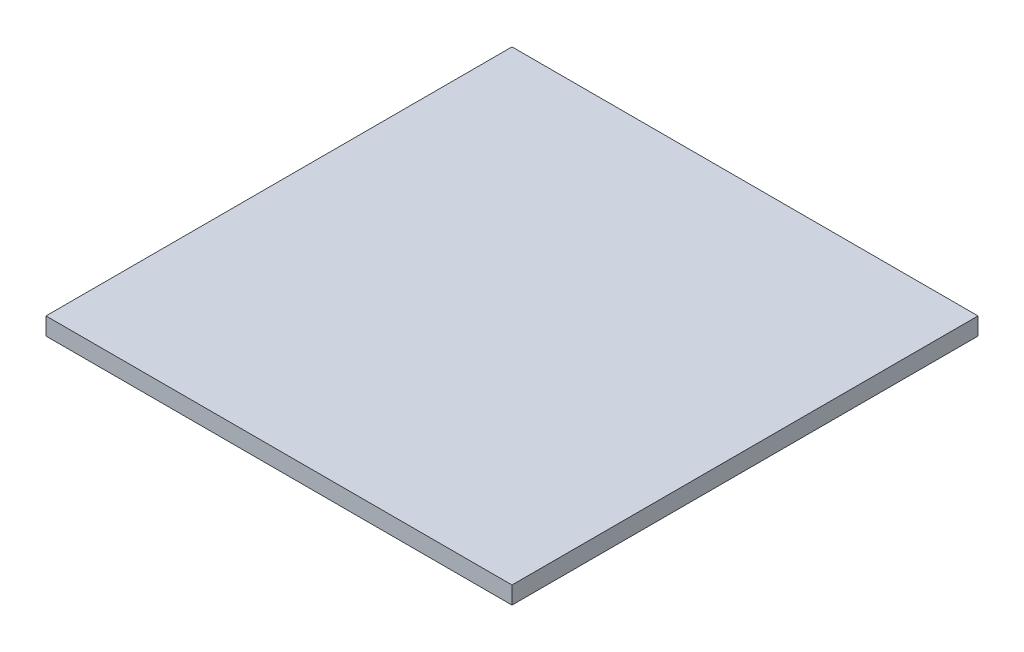
ISO-10303-21;
HEADER;
FILE_DESCRIPTION(('STEP AP214'),'2;1');
FILE_NAME('part.step','',(''),(''),'','','');
FILE_SCHEMA(('AUTOMOTIVE_DESIGN { 1 0 10303 214 1 1 1 1 }'));
ENDSEC;
DATA;
#1=APPLICATION_CONTEXT('core data for automotive mechanical design processes');
#2=APPLICATION_PROTOCOL_DEFINITION('international standard','automotive_design',2000,#1);
#3=PRODUCT_CONTEXT('',#1,'mechanical');
#4=PRODUCT('Part','Part','',(#3));
#5=PRODUCT_RELATED_PRODUCT_CATEGORY('part','',(#4));
#6=PRODUCT_DEFINITION_FORMATION('','',#4);
#7=PRODUCT_DEFINITION_CONTEXT('part definition',#1,'design');
#8=PRODUCT_DEFINITION('design','',#6,#7);
#9=PRODUCT_DEFINITION_SHAPE('','',#8);
#10=(LENGTH_UNIT() NAMED_UNIT(*) SI_UNIT(.MILLI.,.METRE.));
#11=(NAMED_UNIT(*) PLANE_ANGLE_UNIT() SI_UNIT($,.RADIAN.));
#12=(NAMED_UNIT(*) SI_UNIT($,.STERADIAN.) SOLID_ANGLE_UNIT());
#13=UNCERTAINTY_MEASURE_WITH_UNIT(LENGTH_MEASURE(1.E-05),#10,'distance_accuracy_value','');
#14=(GEOMETRIC_REPRESENTATION_CONTEXT(3) GLOBAL_UNCERTAINTY_ASSIGNED_CONTEXT((#13)) GLOBAL_UNIT_ASSIGNED_CONTEXT((#10,
#11,#12)) REPRESENTATION_CONTEXT('',''));
#15=CARTESIAN_POINT('',(0.,0.,0.));
#16=DIRECTION('',(0.,0.,1.));
#17=DIRECTION('',(1.,0.,0.));
#18=AXIS2_PLACEMENT_3D('',#15,#16,#17);
#19=CARTESIAN_POINT('',(20.,1.5,-20.));
#20=DIRECTION('',(-1.,0.,0.));
#21=DIRECTION('',(0.,0.,1.));
#22=AXIS2_PLACEMENT_3D('',#19,#20,#21);
#23=PLANE('',#22);
#24=DIRECTION('',(0.,0.,-1.));
#25=VECTOR('',#24,1.);
#26=CARTESIAN_POINT('',(20.,0.,-20.));
#27=LINE('',#26,#25);
#28=CARTESIAN_POINT('',(20.,0.,20.));
#29=VERTEX_POINT('',#28);
#30=CARTESIAN_POINT('',(20.,0.,-20.));
#31=VERTEX_POINT('',#30);
#32=EDGE_CURVE('E102',#29,#31,#27,.T.);
#33=ORIENTED_EDGE('',*,*,#32,.T.);
#34=DIRECTION('',(0.,-1.,0.));
#35=VECTOR('',#34,1.);
#36=CARTESIAN_POINT('',(20.,1.5,-20.));
#37=LINE('',#36,#35);
#38=CARTESIAN_POINT('',(20.,1.5,-20.));
#39=VERTEX_POINT('',#38);
#40=EDGE_CURVE('E11',#39,#31,#37,.T.);
#41=ORIENTED_EDGE('',*,*,#40,.F.);
#42=DIRECTION('',(0.,0.,-1.));
#43=VECTOR('',#42,1.);
#44=CARTESIAN_POINT('',(20.,1.5,-20.));
#45=LINE('',#44,#43);
#46=CARTESIAN_POINT('',(20.,1.5,20.));
#47=VERTEX_POINT('',#46);
#48=EDGE_CURVE('E90',#47,#39,#45,.T.);
#49=ORIENTED_EDGE('',*,*,#48,.F.);
#50=DIRECTION('',(0.,-1.,0.));
#51=VECTOR('',#50,1.);
#52=CARTESIAN_POINT('',(20.,1.5,20.));
#53=LINE('',#52,#51);
#54=EDGE_CURVE('E98',#47,#29,#53,.T.);
#55=ORIENTED_EDGE('',*,*,#54,.T.);
#56=EDGE_LOOP('',(#33,#41,#49,#55));
#57=FACE_BOUND('',#56,.T.);
#58=ADVANCED_FACE('F39',(#57),#23,.F.);
#59=CARTESIAN_POINT('',(-20.,1.5,-20.));
#60=DIRECTION('',(0.,0.,1.));
#61=DIRECTION('',(1.,0.,0.));
#62=AXIS2_PLACEMENT_3D('',#59,#60,#61);
#63=PLANE('',#62);
#64=DIRECTION('',(-1.,0.,0.));
#65=VECTOR('',#64,1.);
#66=CARTESIAN_POINT('',(-20.,0.,-20.));
#67=LINE('',#66,#65);
#68=CARTESIAN_POINT('',(-20.,0.,-20.));
#69=VERTEX_POINT('',#68);
#70=EDGE_CURVE('E94',#31,#69,#67,.T.);
#71=ORIENTED_EDGE('',*,*,#70,.T.);
#72=DIRECTION('',(0.,-1.,0.));
#73=VECTOR('',#72,1.);
#74=CARTESIAN_POINT('',(-20.,1.5,-20.));
#75=LINE('',#74,#73);
#76=CARTESIAN_POINT('',(-20.,1.5,-20.));
#77=VERTEX_POINT('',#76);
#78=EDGE_CURVE('E47',#77,#69,#75,.T.);
#79=ORIENTED_EDGE('',*,*,#78,.F.);
#80=DIRECTION('',(-1.,0.,0.));
#81=VECTOR('',#80,1.);
#82=CARTESIAN_POINT('',(-20.,1.5,-20.));
#83=LINE('',#82,#81);
#84=EDGE_CURVE('E85',#39,#77,#83,.T.);
#85=ORIENTED_EDGE('',*,*,#84,.F.);
#86=ORIENTED_EDGE('',*,*,#40,.T.);
#87=EDGE_LOOP('',(#71,#79,#85,#86));
#88=FACE_BOUND('',#87,.T.);
#89=ADVANCED_FACE('F93',(#88),#63,.F.);
#90=CARTESIAN_POINT('',(-20.,1.5,-20.));
#91=DIRECTION('',(1.,0.,0.));
#92=DIRECTION('',(0.,0.,-1.));
#93=AXIS2_PLACEMENT_3D('',#90,#91,#92);
#94=PLANE('',#93);
#95=DIRECTION('',(0.,0.,1.));
#96=VECTOR('',#95,1.);
#97=CARTESIAN_POINT('',(-20.,0.,-20.));
#98=LINE('',#97,#96);
#99=CARTESIAN_POINT('',(-20.,0.,20.));
#100=VERTEX_POINT('',#99);
#101=EDGE_CURVE('E72',#69,#100,#98,.T.);
#102=ORIENTED_EDGE('',*,*,#101,.T.);
#103=DIRECTION('',(0.,-1.,0.));
#104=VECTOR('',#103,1.);
#105=CARTESIAN_POINT('',(-20.,1.5,20.));
#106=LINE('',#105,#104);
#107=CARTESIAN_POINT('',(-20.,1.5,20.));
#108=VERTEX_POINT('',#107);
#109=EDGE_CURVE('E95',#108,#100,#106,.T.);
#110=ORIENTED_EDGE('',*,*,#109,.F.);
#111=DIRECTION('',(0.,0.,1.));
#112=VECTOR('',#111,1.);
#113=CARTESIAN_POINT('',(-20.,1.5,-20.));
#114=LINE('',#113,#112);
#115=EDGE_CURVE('E88',#77,#108,#114,.T.);
#116=ORIENTED_EDGE('',*,*,#115,.F.);
#117=ORIENTED_EDGE('',*,*,#78,.T.);
#118=EDGE_LOOP('',(#102,#110,#116,#117));
#119=FACE_BOUND('',#118,.T.);
#120=ADVANCED_FACE('F96',(#119),#94,.F.);
#121=CARTESIAN_POINT('',(-20.,1.5,20.));
#122=DIRECTION('',(0.,0.,-1.));
#123=DIRECTION('',(-1.,0.,0.));
#124=AXIS2_PLACEMENT_3D('',#121,#122,#123);
#125=PLANE('',#124);
#126=DIRECTION('',(1.,0.,0.));
#127=VECTOR('',#126,1.);
#128=CARTESIAN_POINT('',(-20.,0.,20.));
#129=LINE('',#128,#127);
#130=EDGE_CURVE('E78',#100,#29,#129,.T.);
#131=ORIENTED_EDGE('',*,*,#130,.T.);
#132=ORIENTED_EDGE('',*,*,#54,.F.);
#133=DIRECTION('',(1.,0.,0.));
#134=VECTOR('',#133,1.);
#135=CARTESIAN_POINT('',(-20.,1.5,20.));
#136=LINE('',#135,#134);
#137=EDGE_CURVE('E55',#108,#47,#136,.T.);
#138=ORIENTED_EDGE('',*,*,#137,.F.);
#139=ORIENTED_EDGE('',*,*,#109,.T.);
#140=EDGE_LOOP('',(#131,#132,#138,#139));
#141=FACE_BOUND('',#140,.T.);
#142=ADVANCED_FACE('F109',(#141),#125,.F.);
#143=CARTESIAN_POINT('',(0.,1.5,0.));
#144=DIRECTION('',(0.,1.,0.));
#145=DIRECTION('',(0.,0.,1.));
#146=AXIS2_PLACEMENT_3D('',#143,#144,#145);
#147=PLANE('',#146);
#148=ORIENTED_EDGE('',*,*,#48,.T.);
#149=ORIENTED_EDGE('',*,*,#84,.T.);
#150=ORIENTED_EDGE('',*,*,#115,.T.);
#151=ORIENTED_EDGE('',*,*,#137,.T.);
#152=EDGE_LOOP('',(#148,#149,#150,#151));
#153=FACE_BOUND('',#152,.T.);
#154=ADVANCED_FACE('F86',(#153),#147,.T.);
#155=CARTESIAN_POINT('',(0.,0.,0.));
#156=DIRECTION('',(0.,1.,0.));
#157=DIRECTION('',(0.,0.,1.));
#158=AXIS2_PLACEMENT_3D('',#155,#156,#157);
#159=PLANE('',#158);
#160=ORIENTED_EDGE('',*,*,#32,.F.);
#161=ORIENTED_EDGE('',*,*,#130,.F.);
#162=ORIENTED_EDGE('',*,*,#101,.F.);
#163=ORIENTED_EDGE('',*,*,#70,.F.);
#164=EDGE_LOOP('',(#160,#161,#162,#163));
#165=FACE_BOUND('',#164,.T.);
#166=ADVANCED_FACE('F112',(#165),#159,.F.);
#167=CLOSED_SHELL('',(#58,#89,#120,#142,#154,#166));
#168=MANIFOLD_SOLID_BREP('B2',#167);
#169=ADVANCED_BREP_SHAPE_REPRESENTATION('',(#18,#168),#14);
#170=SHAPE_DEFINITION_REPRESENTATION(#9,#169);
ENDSEC;
END-ISO-10303-21;
